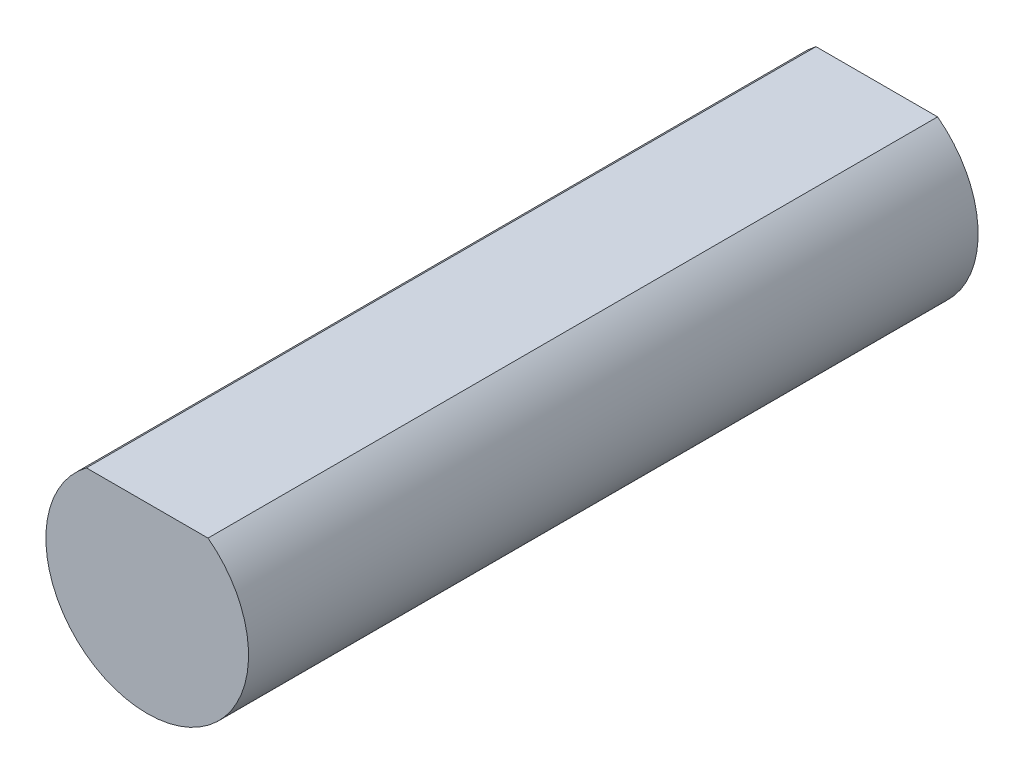
ISO-10303-21;
HEADER;
FILE_DESCRIPTION(('STEP AP214'),'2;1');
FILE_NAME('part.step','',(''),(''),'','','');
FILE_SCHEMA(('AUTOMOTIVE_DESIGN { 1 0 10303 214 1 1 1 1 }'));
ENDSEC;
DATA;
#1=APPLICATION_CONTEXT('core data for automotive mechanical design processes');
#2=APPLICATION_PROTOCOL_DEFINITION('international standard','automotive_design',2000,#1);
#3=PRODUCT_CONTEXT('',#1,'mechanical');
#4=PRODUCT('Part','Part','',(#3));
#5=PRODUCT_RELATED_PRODUCT_CATEGORY('part','',(#4));
#6=PRODUCT_DEFINITION_FORMATION('','',#4);
#7=PRODUCT_DEFINITION_CONTEXT('part definition',#1,'design');
#8=PRODUCT_DEFINITION('design','',#6,#7);
#9=PRODUCT_DEFINITION_SHAPE('','',#8);
#10=(LENGTH_UNIT() NAMED_UNIT(*) SI_UNIT(.MILLI.,.METRE.));
#11=(NAMED_UNIT(*) PLANE_ANGLE_UNIT() SI_UNIT($,.RADIAN.));
#12=(NAMED_UNIT(*) SI_UNIT($,.STERADIAN.) SOLID_ANGLE_UNIT());
#13=UNCERTAINTY_MEASURE_WITH_UNIT(LENGTH_MEASURE(1.E-05),#10,'distance_accuracy_value','');
#14=(GEOMETRIC_REPRESENTATION_CONTEXT(3) GLOBAL_UNCERTAINTY_ASSIGNED_CONTEXT((#13)) GLOBAL_UNIT_ASSIGNED_CONTEXT((#10,
#11,#12)) REPRESENTATION_CONTEXT('',''));
#15=CARTESIAN_POINT('',(0.,0.,0.));
#16=DIRECTION('',(0.,0.,1.));
#17=DIRECTION('',(1.,0.,0.));
#18=AXIS2_PLACEMENT_3D('',#15,#16,#17);
#19=CARTESIAN_POINT('',(0.,2.,18.));
#20=DIRECTION('',(0.,1.,0.));
#21=DIRECTION('',(0.,0.,1.));
#22=AXIS2_PLACEMENT_3D('',#19,#20,#21);
#23=PLANE('',#22);
#24=DIRECTION('',(1.,0.,0.));
#25=VECTOR('',#24,1.);
#26=CARTESIAN_POINT('',(0.,2.,0.));
#27=LINE('',#26,#25);
#28=CARTESIAN_POINT('',(-1.5,2.,0.));
#29=VERTEX_POINT('',#28);
#30=CARTESIAN_POINT('',(1.5,2.,0.));
#31=VERTEX_POINT('',#30);
#32=EDGE_CURVE('E67',#29,#31,#27,.T.);
#33=ORIENTED_EDGE('',*,*,#32,.F.);
#34=DIRECTION('',(0.,0.,-1.));
#35=VECTOR('',#34,1.);
#36=CARTESIAN_POINT('',(-1.5,2.,18.));
#37=LINE('',#36,#35);
#38=CARTESIAN_POINT('',(-1.5,2.,18.));
#39=VERTEX_POINT('',#38);
#40=EDGE_CURVE('E11',#39,#29,#37,.T.);
#41=ORIENTED_EDGE('',*,*,#40,.F.);
#42=DIRECTION('',(1.,0.,0.));
#43=VECTOR('',#42,1.);
#44=CARTESIAN_POINT('',(0.,2.,18.));
#45=LINE('',#44,#43);
#46=CARTESIAN_POINT('',(1.5,2.,18.));
#47=VERTEX_POINT('',#46);
#48=EDGE_CURVE('E68',#39,#47,#45,.T.);
#49=ORIENTED_EDGE('',*,*,#48,.T.);
#50=DIRECTION('',(0.,0.,-1.));
#51=VECTOR('',#50,1.);
#52=CARTESIAN_POINT('',(1.5,2.,18.));
#53=LINE('',#52,#51);
#54=EDGE_CURVE('E47',#47,#31,#53,.T.);
#55=ORIENTED_EDGE('',*,*,#54,.T.);
#56=EDGE_LOOP('',(#33,#41,#49,#55));
#57=FACE_BOUND('',#56,.T.);
#58=ADVANCED_FACE('F39',(#57),#23,.T.);
#59=CARTESIAN_POINT('',(0.,0.,18.));
#60=DIRECTION('',(0.,0.,-1.));
#61=DIRECTION('',(-1.,0.,0.));
#62=AXIS2_PLACEMENT_3D('',#59,#60,#61);
#63=CYLINDRICAL_SURFACE('',#62,2.5);
#64=CARTESIAN_POINT('',(0.,0.,0.));
#65=DIRECTION('',(0.,0.,1.));
#66=DIRECTION('',(1.,0.,0.));
#67=AXIS2_PLACEMENT_3D('',#64,#65,#66);
#68=CIRCLE('',#67,2.5);
#69=EDGE_CURVE('E69',#29,#31,#68,.T.);
#70=ORIENTED_EDGE('',*,*,#69,.T.);
#71=ORIENTED_EDGE('',*,*,#54,.F.);
#72=CARTESIAN_POINT('',(0.,0.,18.));
#73=DIRECTION('',(0.,0.,1.));
#74=DIRECTION('',(1.,0.,0.));
#75=AXIS2_PLACEMENT_3D('',#72,#73,#74);
#76=CIRCLE('',#75,2.5);
#77=EDGE_CURVE('E54',#39,#47,#76,.T.);
#78=ORIENTED_EDGE('',*,*,#77,.F.);
#79=ORIENTED_EDGE('',*,*,#40,.T.);
#80=EDGE_LOOP('',(#70,#71,#78,#79));
#81=FACE_BOUND('',#80,.T.);
#82=ADVANCED_FACE('F70',(#81),#63,.T.);
#83=CARTESIAN_POINT('',(0.,0.,18.));
#84=DIRECTION('',(0.,0.,1.));
#85=DIRECTION('',(1.,0.,0.));
#86=AXIS2_PLACEMENT_3D('',#83,#84,#85);
#87=PLANE('',#86);
#88=ORIENTED_EDGE('',*,*,#48,.F.);
#89=ORIENTED_EDGE('',*,*,#77,.T.);
#90=EDGE_LOOP('',(#88,#89));
#91=FACE_BOUND('',#90,.T.);
#92=ADVANCED_FACE('F78',(#91),#87,.T.);
#93=CARTESIAN_POINT('',(0.,0.,0.));
#94=DIRECTION('',(0.,0.,1.));
#95=DIRECTION('',(1.,0.,0.));
#96=AXIS2_PLACEMENT_3D('',#93,#94,#95);
#97=PLANE('',#96);
#98=ORIENTED_EDGE('',*,*,#32,.T.);
#99=ORIENTED_EDGE('',*,*,#69,.F.);
#100=EDGE_LOOP('',(#98,#99));
#101=FACE_BOUND('',#100,.T.);
#102=ADVANCED_FACE('F73',(#101),#97,.F.);
#103=CLOSED_SHELL('',(#58,#82,#92,#102));
#104=MANIFOLD_SOLID_BREP('B2',#103);
#105=ADVANCED_BREP_SHAPE_REPRESENTATION('',(#18,#104),#14);
#106=SHAPE_DEFINITION_REPRESENTATION(#9,#105);
ENDSEC;
END-ISO-10303-21;
